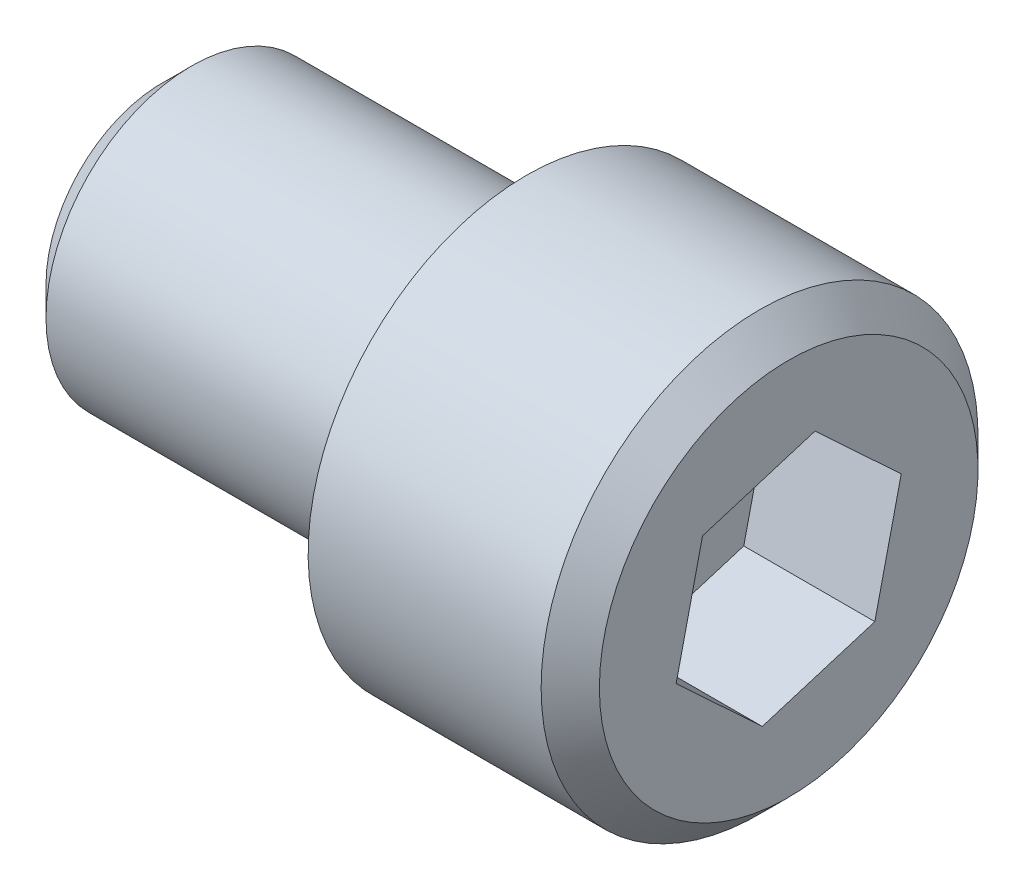
ISO-10303-21;
HEADER;
FILE_DESCRIPTION(('STEP AP214'),'2;1');
FILE_NAME('part.step','',(''),(''),'','','');
FILE_SCHEMA(('AUTOMOTIVE_DESIGN { 1 0 10303 214 1 1 1 1 }'));
ENDSEC;
DATA;
#1=APPLICATION_CONTEXT('core data for automotive mechanical design processes');
#2=APPLICATION_PROTOCOL_DEFINITION('international standard','automotive_design',2000,#1);
#3=PRODUCT_CONTEXT('',#1,'mechanical');
#4=PRODUCT('Part','Part','',(#3));
#5=PRODUCT_RELATED_PRODUCT_CATEGORY('part','',(#4));
#6=PRODUCT_DEFINITION_FORMATION('','',#4);
#7=PRODUCT_DEFINITION_CONTEXT('part definition',#1,'design');
#8=PRODUCT_DEFINITION('design','',#6,#7);
#9=PRODUCT_DEFINITION_SHAPE('','',#8);
#10=(LENGTH_UNIT() NAMED_UNIT(*) SI_UNIT(.MILLI.,.METRE.));
#11=(NAMED_UNIT(*) PLANE_ANGLE_UNIT() SI_UNIT($,.RADIAN.));
#12=(NAMED_UNIT(*) SI_UNIT($,.STERADIAN.) SOLID_ANGLE_UNIT());
#13=UNCERTAINTY_MEASURE_WITH_UNIT(LENGTH_MEASURE(1.E-05),#10,'distance_accuracy_value','');
#14=(GEOMETRIC_REPRESENTATION_CONTEXT(3) GLOBAL_UNCERTAINTY_ASSIGNED_CONTEXT((#13)) GLOBAL_UNIT_ASSIGNED_CONTEXT((#10,
#11,#12)) REPRESENTATION_CONTEXT('',''));
#15=CARTESIAN_POINT('',(0.,0.,0.));
#16=DIRECTION('',(0.,0.,1.));
#17=DIRECTION('',(1.,0.,0.));
#18=AXIS2_PLACEMENT_3D('',#15,#16,#17);
#19=CARTESIAN_POINT('',(21.5392,24.8120582331598,-34.48820473614));
#20=DIRECTION('',(-1.,0.,0.));
#21=DIRECTION('',(0.,0.,1.));
#22=AXIS2_PLACEMENT_3D('',#19,#20,#21);
#23=PLANE('',#22);
#24=DIRECTION('',(0.,0.293071207327264,-0.956090616749134));
#25=VECTOR('',#24,1.);
#26=CARTESIAN_POINT('',(21.5392,20.013116911926,-37.0329010890843));
#27=LINE('',#26,#25);
#28=CARTESIAN_POINT('',(21.5392,19.4114248549138,-35.0699920229629));
#29=VERTEX_POINT('',#28);
#30=CARTESIAN_POINT('',(21.5392,20.013116911926,-37.0329010890844));
#31=VERTEX_POINT('',#30);
#32=EDGE_CURVE('E72',#29,#31,#27,.T.);
#33=ORIENTED_EDGE('',*,*,#32,.T.);
#34=DIRECTION('',(0.,0.974534366088314,-0.224238197711381));
#35=VECTOR('',#34,1.);
#36=CARTESIAN_POINT('',(21.5392,22.0138920570121,-37.4932750155172));
#37=LINE('',#36,#35);
#38=CARTESIAN_POINT('',(21.5392,22.0138920570121,-37.4932750155172));
#39=VERTEX_POINT('',#38);
#40=EDGE_CURVE('E115',#31,#39,#37,.T.);
#41=ORIENTED_EDGE('',*,*,#40,.T.);
#42=DIRECTION('',(0.,0.681463158761051,0.731852419037753));
#43=VECTOR('',#42,1.);
#44=CARTESIAN_POINT('',(21.5392,23.412975145086,-35.9907398758286));
#45=LINE('',#44,#43);
#46=CARTESIAN_POINT('',(21.5392,23.412975145086,-35.9907398758286));
#47=VERTEX_POINT('',#46);
#48=EDGE_CURVE('E120',#39,#47,#45,.T.);
#49=ORIENTED_EDGE('',*,*,#48,.T.);
#50=DIRECTION('',(0.,-0.293071207327263,0.956090616749134));
#51=VECTOR('',#50,1.);
#52=CARTESIAN_POINT('',(21.5392,22.8112830880738,-34.0278308097072));
#53=LINE('',#52,#51);
#54=CARTESIAN_POINT('',(21.5392,22.8112830880738,-34.0278308097072));
#55=VERTEX_POINT('',#54);
#56=EDGE_CURVE('E124',#47,#55,#53,.T.);
#57=ORIENTED_EDGE('',*,*,#56,.T.);
#58=DIRECTION('',(0.,-0.974534366088314,0.224238197711381));
#59=VECTOR('',#58,1.);
#60=CARTESIAN_POINT('',(21.5392,20.8105079429877,-33.5674568832743));
#61=LINE('',#60,#59);
#62=CARTESIAN_POINT('',(21.5392,20.8105079429877,-33.5674568832743));
#63=VERTEX_POINT('',#62);
#64=EDGE_CURVE('E68',#55,#63,#61,.T.);
#65=ORIENTED_EDGE('',*,*,#64,.T.);
#66=DIRECTION('',(0.,-0.681463158761051,-0.731852419037753));
#67=VECTOR('',#66,1.);
#68=CARTESIAN_POINT('',(21.5392,19.4114248549138,-35.0699920229629));
#69=LINE('',#68,#67);
#70=EDGE_CURVE('E70',#63,#29,#69,.T.);
#71=ORIENTED_EDGE('',*,*,#70,.T.);
#72=EDGE_LOOP('',(#33,#41,#49,#57,#65,#71));
#73=FACE_BOUND('',#72,.T.);
#74=ADVANCED_FACE('F17',(#73),#23,.F.);
#75=CARTESIAN_POINT('',(12.9032,22.7969331386024,-34.043241833911));
#76=DIRECTION('',(1.,0.,0.));
#77=DIRECTION('',(0.,1.,0.));
#78=AXIS2_PLACEMENT_3D('',#75,#76,#77);
#79=PLANE('',#78);
#80=CARTESIAN_POINT('',(12.9031999999256,21.4121999999999,-35.5303659493958));
#81=DIRECTION('',(1.,0.,0.));
#82=DIRECTION('',(0.,0.,-1.));
#83=AXIS2_PLACEMENT_3D('',#80,#81,#82);
#84=CIRCLE('',#83,2.03199999999938);
#85=CARTESIAN_POINT('',(12.9031999999256,21.4121999999999,-37.5623659493951));
#86=VERTEX_POINT('',#85);
#87=EDGE_CURVE('E20',#86,#86,#84,.T.);
#88=ORIENTED_EDGE('',*,*,#87,.F.);
#89=EDGE_LOOP('',(#88));
#90=FACE_BOUND('',#89,.T.);
#91=ADVANCED_FACE('F182',(#90),#79,.F.);
#92=CARTESIAN_POINT('',(21.5392,20.013116911926,-37.0329010890843));
#93=DIRECTION('',(0.,-0.956090616749134,-0.293071207327264));
#94=DIRECTION('',(0.,0.293071207327264,-0.956090616749134));
#95=AXIS2_PLACEMENT_3D('',#92,#93,#94);
#96=PLANE('',#95);
#97=ORIENTED_EDGE('',*,*,#32,.F.);
#98=DIRECTION('',(1.,0.,0.));
#99=VECTOR('',#98,1.);
#100=CARTESIAN_POINT('',(21.5392,19.4114248549138,-35.0699920229629));
#101=LINE('',#100,#99);
#102=CARTESIAN_POINT('',(23.8252,19.4114248549138,-35.0699920229629));
#103=VERTEX_POINT('',#102);
#104=EDGE_CURVE('E77',#29,#103,#101,.T.);
#105=ORIENTED_EDGE('',*,*,#104,.T.);
#106=DIRECTION('',(0.,-0.29307120732726,0.956090616749136));
#107=VECTOR('',#106,1.);
#108=CARTESIAN_POINT('',(23.8252,20.013116911926,-37.0329010890844));
#109=LINE('',#108,#107);
#110=CARTESIAN_POINT('',(23.8252,20.013116911926,-37.0329010890844));
#111=VERTEX_POINT('',#110);
#112=EDGE_CURVE('E112',#111,#103,#109,.T.);
#113=ORIENTED_EDGE('',*,*,#112,.F.);
#114=DIRECTION('',(1.,0.,0.));
#115=VECTOR('',#114,1.);
#116=CARTESIAN_POINT('',(21.5392,20.013116911926,-37.0329010890843));
#117=LINE('',#116,#115);
#118=EDGE_CURVE('E83',#111,#31,#117,.F.);
#119=ORIENTED_EDGE('',*,*,#118,.T.);
#120=EDGE_LOOP('',(#97,#105,#113,#119));
#121=FACE_BOUND('',#120,.T.);
#122=ADVANCED_FACE('F80',(#121),#96,.F.);
#123=CARTESIAN_POINT('',(21.5392,19.4114248549138,-35.0699920229629));
#124=DIRECTION('',(0.,-0.731852419037753,0.681463158761051));
#125=DIRECTION('',(0.,-0.681463158761051,-0.731852419037753));
#126=AXIS2_PLACEMENT_3D('',#123,#124,#125);
#127=PLANE('',#126);
#128=ORIENTED_EDGE('',*,*,#70,.F.);
#129=DIRECTION('',(1.,0.,0.));
#130=VECTOR('',#129,1.);
#131=CARTESIAN_POINT('',(21.5392,20.8105079429877,-33.5674568832743));
#132=LINE('',#131,#130);
#133=CARTESIAN_POINT('',(23.8252,20.8105079429877,-33.5674568832743));
#134=VERTEX_POINT('',#133);
#135=EDGE_CURVE('E91',#63,#134,#132,.T.);
#136=ORIENTED_EDGE('',*,*,#135,.T.);
#137=DIRECTION('',(0.,0.681463158761048,0.731852419037756));
#138=VECTOR('',#137,1.);
#139=CARTESIAN_POINT('',(23.8252,19.4114248549138,-35.0699920229629));
#140=LINE('',#139,#138);
#141=EDGE_CURVE('E88',#103,#134,#140,.T.);
#142=ORIENTED_EDGE('',*,*,#141,.F.);
#143=ORIENTED_EDGE('',*,*,#104,.F.);
#144=EDGE_LOOP('',(#128,#136,#142,#143));
#145=FACE_BOUND('',#144,.T.);
#146=ADVANCED_FACE('F86',(#145),#127,.F.);
#147=CARTESIAN_POINT('',(21.5392,20.8105079429877,-33.5674568832743));
#148=DIRECTION('',(0.,0.224238197711381,0.974534366088314));
#149=DIRECTION('',(0.,-0.974534366088314,0.224238197711381));
#150=AXIS2_PLACEMENT_3D('',#147,#148,#149);
#151=PLANE('',#150);
#152=ORIENTED_EDGE('',*,*,#64,.F.);
#153=DIRECTION('',(1.,0.,0.));
#154=VECTOR('',#153,1.);
#155=CARTESIAN_POINT('',(21.5392,22.8112830880738,-34.0278308097072));
#156=LINE('',#155,#154);
#157=CARTESIAN_POINT('',(23.8252,22.8112830880738,-34.0278308097072));
#158=VERTEX_POINT('',#157);
#159=EDGE_CURVE('E122',#55,#158,#156,.T.);
#160=ORIENTED_EDGE('',*,*,#159,.T.);
#161=DIRECTION('',(0.,0.974534366088314,-0.224238197711379));
#162=VECTOR('',#161,1.);
#163=CARTESIAN_POINT('',(23.8252,20.8105079429877,-33.5674568832743));
#164=LINE('',#163,#162);
#165=EDGE_CURVE('E128',#134,#158,#164,.T.);
#166=ORIENTED_EDGE('',*,*,#165,.F.);
#167=ORIENTED_EDGE('',*,*,#135,.F.);
#168=EDGE_LOOP('',(#152,#160,#166,#167));
#169=FACE_BOUND('',#168,.T.);
#170=ADVANCED_FACE('F129',(#169),#151,.F.);
#171=CARTESIAN_POINT('',(21.5392,22.8112830880738,-34.0278308097072));
#172=DIRECTION('',(0.,0.956090616749134,0.293071207327263));
#173=DIRECTION('',(0.,-0.293071207327263,0.956090616749134));
#174=AXIS2_PLACEMENT_3D('',#171,#172,#173);
#175=PLANE('',#174);
#176=ORIENTED_EDGE('',*,*,#56,.F.);
#177=DIRECTION('',(1.,0.,0.));
#178=VECTOR('',#177,1.);
#179=CARTESIAN_POINT('',(21.5392,23.412975145086,-35.9907398758286));
#180=LINE('',#179,#178);
#181=CARTESIAN_POINT('',(23.8252,23.412975145086,-35.9907398758286));
#182=VERTEX_POINT('',#181);
#183=EDGE_CURVE('E118',#47,#182,#180,.T.);
#184=ORIENTED_EDGE('',*,*,#183,.T.);
#185=DIRECTION('',(0.,0.293071207327265,-0.956090616749134));
#186=VECTOR('',#185,1.);
#187=CARTESIAN_POINT('',(23.8252,22.8112830880738,-34.0278308097072));
#188=LINE('',#187,#186);
#189=EDGE_CURVE('E134',#158,#182,#188,.T.);
#190=ORIENTED_EDGE('',*,*,#189,.F.);
#191=ORIENTED_EDGE('',*,*,#159,.F.);
#192=EDGE_LOOP('',(#176,#184,#190,#191));
#193=FACE_BOUND('',#192,.T.);
#194=ADVANCED_FACE('F228',(#193),#175,.F.);
#195=CARTESIAN_POINT('',(21.5392,23.412975145086,-35.9907398758286));
#196=DIRECTION('',(0.,0.731852419037753,-0.681463158761051));
#197=DIRECTION('',(0.,0.681463158761051,0.731852419037753));
#198=AXIS2_PLACEMENT_3D('',#195,#196,#197);
#199=PLANE('',#198);
#200=ORIENTED_EDGE('',*,*,#48,.F.);
#201=DIRECTION('',(1.,0.,0.));
#202=VECTOR('',#201,1.);
#203=CARTESIAN_POINT('',(21.5392,22.0138920570121,-37.4932750155172));
#204=LINE('',#203,#202);
#205=CARTESIAN_POINT('',(23.8252,22.0138920570121,-37.4932750155172));
#206=VERTEX_POINT('',#205);
#207=EDGE_CURVE('E35',#39,#206,#204,.T.);
#208=ORIENTED_EDGE('',*,*,#207,.T.);
#209=DIRECTION('',(0.,-0.681463158761053,-0.731852419037751));
#210=VECTOR('',#209,1.);
#211=CARTESIAN_POINT('',(23.8252,23.412975145086,-35.9907398758286));
#212=LINE('',#211,#210);
#213=EDGE_CURVE('E108',#182,#206,#212,.T.);
#214=ORIENTED_EDGE('',*,*,#213,.F.);
#215=ORIENTED_EDGE('',*,*,#183,.F.);
#216=EDGE_LOOP('',(#200,#208,#214,#215));
#217=FACE_BOUND('',#216,.T.);
#218=ADVANCED_FACE('F213',(#217),#199,.F.);
#219=CARTESIAN_POINT('',(21.5392,22.0138920570121,-37.4932750155172));
#220=DIRECTION('',(0.,-0.224238197711381,-0.974534366088314));
#221=DIRECTION('',(0.,0.974534366088314,-0.224238197711381));
#222=AXIS2_PLACEMENT_3D('',#219,#220,#221);
#223=PLANE('',#222);
#224=ORIENTED_EDGE('',*,*,#40,.F.);
#225=ORIENTED_EDGE('',*,*,#118,.F.);
#226=DIRECTION('',(0.,-0.974534366088316,0.224238197711373));
#227=VECTOR('',#226,1.);
#228=CARTESIAN_POINT('',(23.8252,22.0138920570121,-37.4932750155172));
#229=LINE('',#228,#227);
#230=EDGE_CURVE('E103',#206,#111,#229,.T.);
#231=ORIENTED_EDGE('',*,*,#230,.F.);
#232=ORIENTED_EDGE('',*,*,#207,.F.);
#233=EDGE_LOOP('',(#224,#225,#231,#232));
#234=FACE_BOUND('',#233,.T.);
#235=ADVANCED_FACE('F193',(#234),#223,.F.);
#236=CARTESIAN_POINT('',(13.4112000000073,21.4121999999999,-35.5303659493958));
#237=DIRECTION('',(1.,0.,0.));
#238=DIRECTION('',(0.,0.,-1.));
#239=AXIS2_PLACEMENT_3D('',#236,#237,#238);
#240=CONICAL_SURFACE('',#239,2.54000000002421,0.7853981633415);
#241=ORIENTED_EDGE('',*,*,#87,.T.);
#242=EDGE_LOOP('',(#241));
#243=FACE_BOUND('',#242,.T.);
#244=CARTESIAN_POINT('',(13.4112,21.4121999999999,-35.5303659493958));
#245=DIRECTION('',(-1.,0.,0.));
#246=DIRECTION('',(0.,-1.,0.));
#247=AXIS2_PLACEMENT_3D('',#244,#245,#246);
#248=CIRCLE('',#247,2.54);
#249=CARTESIAN_POINT('',(13.4112,18.8721999999999,-35.5303659493958));
#250=VERTEX_POINT('',#249);
#251=EDGE_CURVE('E99',#250,#250,#248,.F.);
#252=ORIENTED_EDGE('',*,*,#251,.F.);
#253=EDGE_LOOP('',(#252));
#254=FACE_BOUND('',#253,.T.);
#255=ADVANCED_FACE('F190',(#243,#254),#240,.T.);
#256=CARTESIAN_POINT('',(23.8252,21.4121999999999,-35.5303659493958));
#257=DIRECTION('',(1.,0.,0.));
#258=DIRECTION('',(0.,1.,0.));
#259=AXIS2_PLACEMENT_3D('',#256,#257,#258);
#260=PLANE('',#259);
#261=ORIENTED_EDGE('',*,*,#213,.T.);
#262=ORIENTED_EDGE('',*,*,#230,.T.);
#263=ORIENTED_EDGE('',*,*,#112,.T.);
#264=ORIENTED_EDGE('',*,*,#141,.T.);
#265=ORIENTED_EDGE('',*,*,#165,.T.);
#266=ORIENTED_EDGE('',*,*,#189,.T.);
#267=EDGE_LOOP('',(#261,#262,#263,#264,#265,#266));
#268=FACE_BOUND('',#267,.T.);
#269=CARTESIAN_POINT('',(23.8252000000898,21.4121999999999,-35.5303659493958));
#270=DIRECTION('',(-1.,0.,0.));
#271=DIRECTION('',(0.,0.,1.));
#272=AXIS2_PLACEMENT_3D('',#269,#270,#271);
#273=CIRCLE('',#272,3.3020000113173);
#274=CARTESIAN_POINT('',(23.8252000000898,21.4121999999999,-32.2283659380785));
#275=VERTEX_POINT('',#274);
#276=EDGE_CURVE('E97',#275,#275,#273,.T.);
#277=ORIENTED_EDGE('',*,*,#276,.F.);
#278=EDGE_LOOP('',(#277));
#279=FACE_BOUND('',#278,.T.);
#280=ADVANCED_FACE('F137',(#268,#279),#260,.T.);
#281=CARTESIAN_POINT('',(19.5707,21.4121999999999,-35.5303659493958));
#282=DIRECTION('',(-1.,0.,0.));
#283=DIRECTION('',(0.,-1.,0.));
#284=AXIS2_PLACEMENT_3D('',#281,#282,#283);
#285=CYLINDRICAL_SURFACE('',#284,2.54);
#286=CARTESIAN_POINT('',(19.2532,21.4121999999999,-35.5303659493958));
#287=DIRECTION('',(-1.,0.,0.));
#288=DIRECTION('',(0.,-1.,0.));
#289=AXIS2_PLACEMENT_3D('',#286,#287,#288);
#290=CIRCLE('',#289,2.54);
#291=CARTESIAN_POINT('',(19.2532,18.8721999999999,-35.5303659493958));
#292=VERTEX_POINT('',#291);
#293=EDGE_CURVE('E95',#292,#292,#290,.T.);
#294=ORIENTED_EDGE('',*,*,#293,.T.);
#295=EDGE_LOOP('',(#294));
#296=FACE_BOUND('',#295,.T.);
#297=ORIENTED_EDGE('',*,*,#251,.T.);
#298=EDGE_LOOP('',(#297));
#299=FACE_BOUND('',#298,.T.);
#300=ADVANCED_FACE('F151',(#296,#299),#285,.T.);
#301=CARTESIAN_POINT('',(23.3172000113768,21.4121999999999,-35.5303659493958));
#302=DIRECTION('',(-1.,0.,0.));
#303=DIRECTION('',(0.,0.,1.));
#304=AXIS2_PLACEMENT_3D('',#301,#302,#303);
#305=CONICAL_SURFACE('',#304,3.81000000003028,0.785398163397448);
#306=ORIENTED_EDGE('',*,*,#276,.T.);
#307=EDGE_LOOP('',(#306));
#308=FACE_BOUND('',#307,.T.);
#309=CARTESIAN_POINT('',(23.3172000113547,21.4121999999999,-35.5303659493958));
#310=DIRECTION('',(1.,0.,0.));
#311=DIRECTION('',(0.,1.,0.));
#312=AXIS2_PLACEMENT_3D('',#309,#310,#311);
#313=CIRCLE('',#312,3.81);
#314=CARTESIAN_POINT('',(23.3172000113547,25.2221999999999,-35.5303659493958));
#315=VERTEX_POINT('',#314);
#316=EDGE_CURVE('E26',#315,#315,#313,.F.);
#317=ORIENTED_EDGE('',*,*,#316,.F.);
#318=EDGE_LOOP('',(#317));
#319=FACE_BOUND('',#318,.T.);
#320=ADVANCED_FACE('F148',(#308,#319),#305,.T.);
#321=CARTESIAN_POINT('',(19.2532,21.4121999999999,-35.5303659493958));
#322=DIRECTION('',(1.,0.,0.));
#323=DIRECTION('',(0.,1.,0.));
#324=AXIS2_PLACEMENT_3D('',#321,#322,#323);
#325=PLANE('',#324);
#326=ORIENTED_EDGE('',*,*,#293,.F.);
#327=EDGE_LOOP('',(#326));
#328=FACE_BOUND('',#327,.T.);
#329=CARTESIAN_POINT('',(19.2532,21.4121999999999,-35.5303659493958));
#330=DIRECTION('',(1.,0.,0.));
#331=DIRECTION('',(0.,1.,0.));
#332=AXIS2_PLACEMENT_3D('',#329,#330,#331);
#333=CIRCLE('',#332,3.81);
#334=CARTESIAN_POINT('',(19.2532,25.2221999999999,-35.5303659493958));
#335=VERTEX_POINT('',#334);
#336=EDGE_CURVE('E11',#335,#335,#333,.T.);
#337=ORIENTED_EDGE('',*,*,#336,.F.);
#338=EDGE_LOOP('',(#337));
#339=FACE_BOUND('',#338,.T.);
#340=ADVANCED_FACE('F150',(#328,#339),#325,.F.);
#341=CARTESIAN_POINT('',(23.8252,21.4121999999999,-35.5303659493958));
#342=DIRECTION('',(1.,0.,0.));
#343=DIRECTION('',(0.,1.,0.));
#344=AXIS2_PLACEMENT_3D('',#341,#342,#343);
#345=CYLINDRICAL_SURFACE('',#344,3.81);
#346=ORIENTED_EDGE('',*,*,#316,.T.);
#347=EDGE_LOOP('',(#346));
#348=FACE_BOUND('',#347,.T.);
#349=ORIENTED_EDGE('',*,*,#336,.T.);
#350=EDGE_LOOP('',(#349));
#351=FACE_BOUND('',#350,.T.);
#352=ADVANCED_FACE('F145',(#348,#351),#345,.T.);
#353=CLOSED_SHELL('',(#74,#91,#122,#146,#170,#194,#218,#235,#255,#280,#300,#320,#340,#352));
#354=MANIFOLD_SOLID_BREP('B1',#353);
#355=ADVANCED_BREP_SHAPE_REPRESENTATION('',(#18,#354),#14);
#356=SHAPE_DEFINITION_REPRESENTATION(#9,#355);
ENDSEC;
END-ISO-10303-21;
